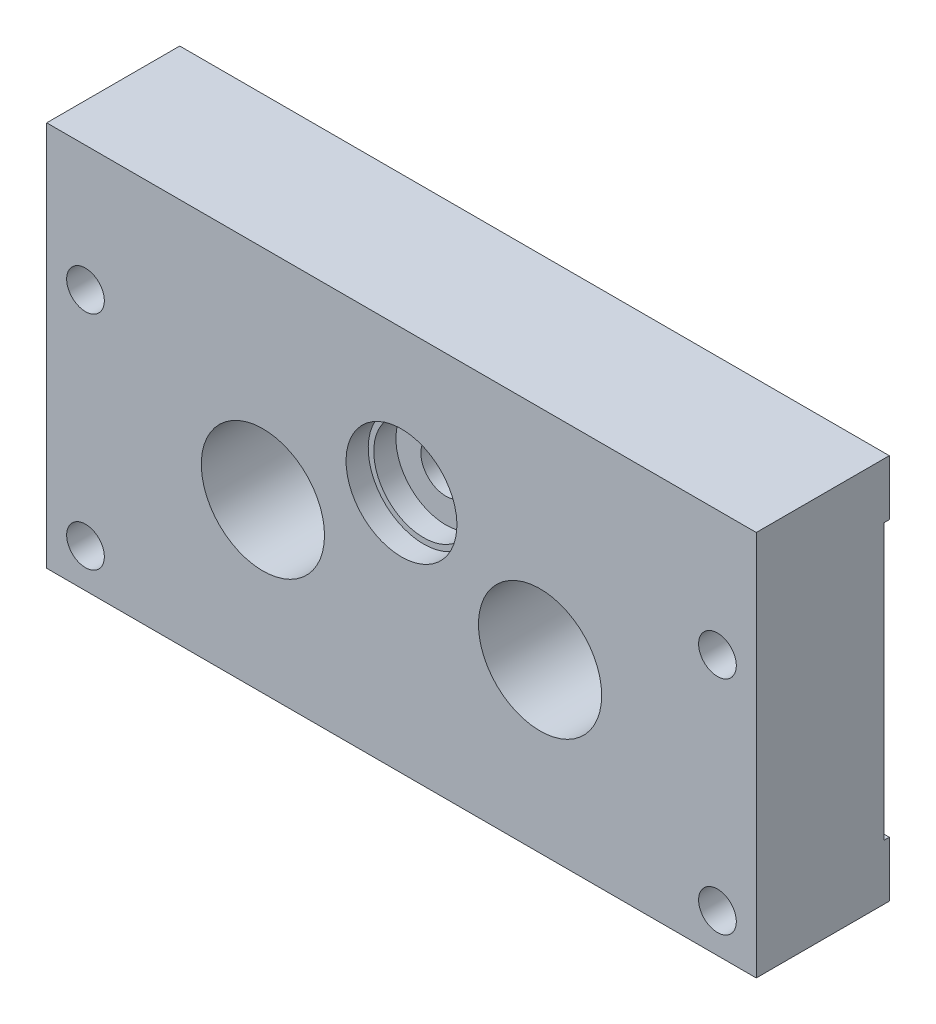
ISO-10303-21;
HEADER;
FILE_DESCRIPTION(('STEP AP214'),'2;1');
FILE_NAME('part.step','',(''),(''),'','','');
FILE_SCHEMA(('AUTOMOTIVE_DESIGN { 1 0 10303 214 1 1 1 1 }'));
ENDSEC;
DATA;
#1=APPLICATION_CONTEXT('core data for automotive mechanical design processes');
#2=APPLICATION_PROTOCOL_DEFINITION('international standard','automotive_design',2000,#1);
#3=PRODUCT_CONTEXT('',#1,'mechanical');
#4=PRODUCT('Part','Part','',(#3));
#5=PRODUCT_RELATED_PRODUCT_CATEGORY('part','',(#4));
#6=PRODUCT_DEFINITION_FORMATION('','',#4);
#7=PRODUCT_DEFINITION_CONTEXT('part definition',#1,'design');
#8=PRODUCT_DEFINITION('design','',#6,#7);
#9=PRODUCT_DEFINITION_SHAPE('','',#8);
#10=(LENGTH_UNIT() NAMED_UNIT(*) SI_UNIT(.MILLI.,.METRE.));
#11=(NAMED_UNIT(*) PLANE_ANGLE_UNIT() SI_UNIT($,.RADIAN.));
#12=(NAMED_UNIT(*) SI_UNIT($,.STERADIAN.) SOLID_ANGLE_UNIT());
#13=UNCERTAINTY_MEASURE_WITH_UNIT(LENGTH_MEASURE(1.E-05),#10,'distance_accuracy_value','');
#14=(GEOMETRIC_REPRESENTATION_CONTEXT(3) GLOBAL_UNCERTAINTY_ASSIGNED_CONTEXT((#13)) GLOBAL_UNIT_ASSIGNED_CONTEXT((#10,
#11,#12)) REPRESENTATION_CONTEXT('',''));
#15=CARTESIAN_POINT('',(0.,0.,0.));
#16=DIRECTION('',(0.,0.,1.));
#17=DIRECTION('',(1.,0.,0.));
#18=AXIS2_PLACEMENT_3D('',#15,#16,#17);
#19=CARTESIAN_POINT('',(32.,21.89,8.));
#20=DIRECTION('',(0.,0.,1.));
#21=DIRECTION('',(1.,0.,0.));
#22=AXIS2_PLACEMENT_3D('',#19,#20,#21);
#23=CYLINDRICAL_SURFACE('',#22,4.5);
#24=CARTESIAN_POINT('',(32.,21.89,8.));
#25=DIRECTION('',(0.,0.,1.));
#26=DIRECTION('',(1.,0.,0.));
#27=AXIS2_PLACEMENT_3D('',#24,#25,#26);
#28=CIRCLE('',#27,4.5);
#29=CARTESIAN_POINT('',(36.5,21.89,8.));
#30=VERTEX_POINT('',#29);
#31=EDGE_CURVE('E21',#30,#30,#28,.T.);
#32=ORIENTED_EDGE('',*,*,#31,.F.);
#33=EDGE_LOOP('',(#32));
#34=FACE_BOUND('',#33,.T.);
#35=CARTESIAN_POINT('',(32.,21.89,10.));
#36=DIRECTION('',(0.,0.,1.));
#37=DIRECTION('',(1.,0.,0.));
#38=AXIS2_PLACEMENT_3D('',#35,#36,#37);
#39=CIRCLE('',#38,4.5);
#40=CARTESIAN_POINT('',(36.5,21.89,10.));
#41=VERTEX_POINT('',#40);
#42=EDGE_CURVE('E339',#41,#41,#39,.F.);
#43=ORIENTED_EDGE('',*,*,#42,.F.);
#44=EDGE_LOOP('',(#43));
#45=FACE_BOUND('',#44,.T.);
#46=ADVANCED_FACE('F17',(#34,#45),#23,.F.);
#47=CARTESIAN_POINT('',(27.446,17.336,8.));
#48=DIRECTION('',(0.,0.,1.));
#49=DIRECTION('',(1.,0.,0.));
#50=AXIS2_PLACEMENT_3D('',#47,#48,#49);
#51=PLANE('',#50);
#52=CARTESIAN_POINT('',(32.,21.89,8.));
#53=DIRECTION('',(0.,0.,1.));
#54=DIRECTION('',(1.,0.,0.));
#55=AXIS2_PLACEMENT_3D('',#52,#53,#54);
#56=CIRCLE('',#55,2.25);
#57=CARTESIAN_POINT('',(34.25,21.89,8.));
#58=VERTEX_POINT('',#57);
#59=EDGE_CURVE('E337',#58,#58,#56,.T.);
#60=ORIENTED_EDGE('',*,*,#59,.F.);
#61=EDGE_LOOP('',(#60));
#62=FACE_BOUND('',#61,.T.);
#63=ORIENTED_EDGE('',*,*,#31,.T.);
#64=EDGE_LOOP('',(#63));
#65=FACE_BOUND('',#64,.T.);
#66=ADVANCED_FACE('F346',(#62,#65),#51,.T.);
#67=CARTESIAN_POINT('',(26.94,16.83,10.));
#68=DIRECTION('',(0.,0.,1.));
#69=DIRECTION('',(1.,0.,0.));
#70=AXIS2_PLACEMENT_3D('',#67,#68,#69);
#71=PLANE('',#70);
#72=ORIENTED_EDGE('',*,*,#42,.T.);
#73=EDGE_LOOP('',(#72));
#74=FACE_BOUND('',#73,.T.);
#75=CARTESIAN_POINT('',(32.,21.89,10.));
#76=DIRECTION('',(0.,0.,1.));
#77=DIRECTION('',(0.,-1.,0.));
#78=AXIS2_PLACEMENT_3D('',#75,#76,#77);
#79=CIRCLE('',#78,5.);
#80=CARTESIAN_POINT('',(32.,16.89,10.));
#81=VERTEX_POINT('',#80);
#82=EDGE_CURVE('E334',#81,#81,#79,.F.);
#83=ORIENTED_EDGE('',*,*,#82,.F.);
#84=EDGE_LOOP('',(#83));
#85=FACE_BOUND('',#84,.T.);
#86=ADVANCED_FACE('F355',(#74,#85),#71,.T.);
#87=CARTESIAN_POINT('',(32.,21.89,6.2));
#88=DIRECTION('',(0.,0.,1.));
#89=DIRECTION('',(1.,0.,0.));
#90=AXIS2_PLACEMENT_3D('',#87,#88,#89);
#91=CYLINDRICAL_SURFACE('',#90,2.25);
#92=ORIENTED_EDGE('',*,*,#59,.T.);
#93=EDGE_LOOP('',(#92));
#94=FACE_BOUND('',#93,.T.);
#95=CARTESIAN_POINT('',(32.,21.89,6.2));
#96=DIRECTION('',(0.,0.,1.));
#97=DIRECTION('',(1.,0.,0.));
#98=AXIS2_PLACEMENT_3D('',#95,#96,#97);
#99=CIRCLE('',#98,2.25);
#100=CARTESIAN_POINT('',(34.25,21.89,6.2));
#101=VERTEX_POINT('',#100);
#102=EDGE_CURVE('E331',#101,#101,#99,.T.);
#103=ORIENTED_EDGE('',*,*,#102,.F.);
#104=EDGE_LOOP('',(#103));
#105=FACE_BOUND('',#104,.T.);
#106=ADVANCED_FACE('F427',(#94,#105),#91,.F.);
#107=CARTESIAN_POINT('',(32.,21.89,10.));
#108=DIRECTION('',(0.,0.,1.));
#109=DIRECTION('',(0.,-1.,0.));
#110=AXIS2_PLACEMENT_3D('',#107,#108,#109);
#111=CYLINDRICAL_SURFACE('',#110,5.);
#112=ORIENTED_EDGE('',*,*,#82,.T.);
#113=EDGE_LOOP('',(#112));
#114=FACE_BOUND('',#113,.T.);
#115=CARTESIAN_POINT('',(32.,21.89,12.));
#116=DIRECTION('',(0.,0.,1.));
#117=DIRECTION('',(0.,-1.,0.));
#118=AXIS2_PLACEMENT_3D('',#115,#116,#117);
#119=CIRCLE('',#118,5.);
#120=CARTESIAN_POINT('',(32.,16.89,12.));
#121=VERTEX_POINT('',#120);
#122=EDGE_CURVE('E217',#121,#121,#119,.T.);
#123=ORIENTED_EDGE('',*,*,#122,.T.);
#124=EDGE_LOOP('',(#123));
#125=FACE_BOUND('',#124,.T.);
#126=ADVANCED_FACE('F424',(#114,#125),#111,.F.);
#127=CARTESIAN_POINT('',(3.5,3.5,12.));
#128=DIRECTION('',(0.,0.,-1.));
#129=DIRECTION('',(-1.,0.,0.));
#130=AXIS2_PLACEMENT_3D('',#127,#128,#129);
#131=CYLINDRICAL_SURFACE('',#130,1.7);
#132=CARTESIAN_POINT('',(3.5,3.5,12.));
#133=DIRECTION('',(0.,0.,-1.));
#134=DIRECTION('',(-1.,0.,0.));
#135=AXIS2_PLACEMENT_3D('',#132,#133,#134);
#136=CIRCLE('',#135,1.7);
#137=CARTESIAN_POINT('',(1.8,3.5,12.));
#138=VERTEX_POINT('',#137);
#139=EDGE_CURVE('E312',#138,#138,#136,.F.);
#140=ORIENTED_EDGE('',*,*,#139,.T.);
#141=EDGE_LOOP('',(#140));
#142=FACE_BOUND('',#141,.T.);
#143=CARTESIAN_POINT('',(3.5,3.5,9.));
#144=DIRECTION('',(0.,0.,-1.));
#145=DIRECTION('',(-1.,0.,0.));
#146=AXIS2_PLACEMENT_3D('',#143,#144,#145);
#147=CIRCLE('',#146,1.7);
#148=CARTESIAN_POINT('',(1.8,3.5,9.));
#149=VERTEX_POINT('',#148);
#150=EDGE_CURVE('E114',#149,#149,#147,.T.);
#151=ORIENTED_EDGE('',*,*,#150,.T.);
#152=EDGE_LOOP('',(#151));
#153=FACE_BOUND('',#152,.T.);
#154=ADVANCED_FACE('F420',(#142,#153),#131,.F.);
#155=CARTESIAN_POINT('',(60.5,3.5,12.));
#156=DIRECTION('',(0.,0.,-1.));
#157=DIRECTION('',(-1.,0.,0.));
#158=AXIS2_PLACEMENT_3D('',#155,#156,#157);
#159=CYLINDRICAL_SURFACE('',#158,1.7);
#160=CARTESIAN_POINT('',(60.5,3.5,12.));
#161=DIRECTION('',(0.,0.,-1.));
#162=DIRECTION('',(-1.,0.,0.));
#163=AXIS2_PLACEMENT_3D('',#160,#161,#162);
#164=CIRCLE('',#163,1.7);
#165=CARTESIAN_POINT('',(58.8,3.5,12.));
#166=VERTEX_POINT('',#165);
#167=EDGE_CURVE('E208',#166,#166,#164,.F.);
#168=ORIENTED_EDGE('',*,*,#167,.T.);
#169=EDGE_LOOP('',(#168));
#170=FACE_BOUND('',#169,.T.);
#171=CARTESIAN_POINT('',(60.5,3.5,9.));
#172=DIRECTION('',(0.,0.,-1.));
#173=DIRECTION('',(-1.,0.,0.));
#174=AXIS2_PLACEMENT_3D('',#171,#172,#173);
#175=CIRCLE('',#174,1.7);
#176=CARTESIAN_POINT('',(58.8,3.5,9.));
#177=VERTEX_POINT('',#176);
#178=EDGE_CURVE('E328',#177,#177,#175,.T.);
#179=ORIENTED_EDGE('',*,*,#178,.T.);
#180=EDGE_LOOP('',(#179));
#181=FACE_BOUND('',#180,.T.);
#182=ADVANCED_FACE('F416',(#170,#181),#159,.F.);
#183=CARTESIAN_POINT('',(19.5,15.1,3.9999906));
#184=DIRECTION('',(0.,0.,1.));
#185=DIRECTION('',(1.,0.,0.));
#186=AXIS2_PLACEMENT_3D('',#183,#184,#185);
#187=CYLINDRICAL_SURFACE('',#186,5.55625);
#188=CARTESIAN_POINT('',(19.5,15.1,3.9999906));
#189=DIRECTION('',(0.,0.,1.));
#190=DIRECTION('',(1.,0.,0.));
#191=AXIS2_PLACEMENT_3D('',#188,#189,#190);
#192=CIRCLE('',#191,5.55625);
#193=CARTESIAN_POINT('',(25.05625,15.1,3.9999906));
#194=VERTEX_POINT('',#193);
#195=EDGE_CURVE('E198',#194,#194,#192,.F.);
#196=ORIENTED_EDGE('',*,*,#195,.T.);
#197=EDGE_LOOP('',(#196));
#198=FACE_BOUND('',#197,.T.);
#199=CARTESIAN_POINT('',(19.5,15.1,12.));
#200=DIRECTION('',(0.,0.,1.));
#201=DIRECTION('',(1.,0.,0.));
#202=AXIS2_PLACEMENT_3D('',#199,#200,#201);
#203=CIRCLE('',#202,5.55625);
#204=CARTESIAN_POINT('',(25.05625,15.1,12.));
#205=VERTEX_POINT('',#204);
#206=EDGE_CURVE('E318',#205,#205,#203,.T.);
#207=ORIENTED_EDGE('',*,*,#206,.T.);
#208=EDGE_LOOP('',(#207));
#209=FACE_BOUND('',#208,.T.);
#210=ADVANCED_FACE('F412',(#198,#209),#187,.F.);
#211=CARTESIAN_POINT('',(44.5,15.1,3.9999906));
#212=DIRECTION('',(0.,0.,1.));
#213=DIRECTION('',(1.,0.,0.));
#214=AXIS2_PLACEMENT_3D('',#211,#212,#213);
#215=CYLINDRICAL_SURFACE('',#214,5.55625);
#216=CARTESIAN_POINT('',(44.5,15.1,3.9999906));
#217=DIRECTION('',(0.,0.,1.));
#218=DIRECTION('',(1.,0.,0.));
#219=AXIS2_PLACEMENT_3D('',#216,#217,#218);
#220=CIRCLE('',#219,5.55625);
#221=CARTESIAN_POINT('',(50.05625,15.1,3.9999906));
#222=VERTEX_POINT('',#221);
#223=EDGE_CURVE('E302',#222,#222,#220,.F.);
#224=ORIENTED_EDGE('',*,*,#223,.T.);
#225=EDGE_LOOP('',(#224));
#226=FACE_BOUND('',#225,.T.);
#227=CARTESIAN_POINT('',(44.5,15.1,12.));
#228=DIRECTION('',(0.,0.,1.));
#229=DIRECTION('',(1.,0.,0.));
#230=AXIS2_PLACEMENT_3D('',#227,#228,#229);
#231=CIRCLE('',#230,5.55625);
#232=CARTESIAN_POINT('',(50.05625,15.1,12.));
#233=VERTEX_POINT('',#232);
#234=EDGE_CURVE('E321',#233,#233,#231,.T.);
#235=ORIENTED_EDGE('',*,*,#234,.T.);
#236=EDGE_LOOP('',(#235));
#237=FACE_BOUND('',#236,.T.);
#238=ADVANCED_FACE('F408',(#226,#237),#215,.F.);
#239=CARTESIAN_POINT('',(3.5,23.5,12.));
#240=DIRECTION('',(0.,0.,-1.));
#241=DIRECTION('',(-1.,0.,0.));
#242=AXIS2_PLACEMENT_3D('',#239,#240,#241);
#243=CYLINDRICAL_SURFACE('',#242,1.7);
#244=CARTESIAN_POINT('',(3.5,23.5,12.));
#245=DIRECTION('',(0.,0.,-1.));
#246=DIRECTION('',(-1.,0.,0.));
#247=AXIS2_PLACEMENT_3D('',#244,#245,#246);
#248=CIRCLE('',#247,1.7);
#249=CARTESIAN_POINT('',(1.8,23.5,12.));
#250=VERTEX_POINT('',#249);
#251=EDGE_CURVE('E315',#250,#250,#248,.F.);
#252=ORIENTED_EDGE('',*,*,#251,.T.);
#253=EDGE_LOOP('',(#252));
#254=FACE_BOUND('',#253,.T.);
#255=CARTESIAN_POINT('',(3.5,23.5,9.));
#256=DIRECTION('',(0.,0.,-1.));
#257=DIRECTION('',(-1.,0.,0.));
#258=AXIS2_PLACEMENT_3D('',#255,#256,#257);
#259=CIRCLE('',#258,1.7);
#260=CARTESIAN_POINT('',(1.8,23.5,9.));
#261=VERTEX_POINT('',#260);
#262=EDGE_CURVE('E299',#261,#261,#259,.T.);
#263=ORIENTED_EDGE('',*,*,#262,.T.);
#264=EDGE_LOOP('',(#263));
#265=FACE_BOUND('',#264,.T.);
#266=ADVANCED_FACE('F404',(#254,#265),#243,.F.);
#267=CARTESIAN_POINT('',(60.5,23.5,12.));
#268=DIRECTION('',(0.,0.,-1.));
#269=DIRECTION('',(-1.,0.,0.));
#270=AXIS2_PLACEMENT_3D('',#267,#268,#269);
#271=CYLINDRICAL_SURFACE('',#270,1.7);
#272=CARTESIAN_POINT('',(60.5,23.5,12.));
#273=DIRECTION('',(0.,0.,-1.));
#274=DIRECTION('',(-1.,0.,0.));
#275=AXIS2_PLACEMENT_3D('',#272,#273,#274);
#276=CIRCLE('',#275,1.7);
#277=CARTESIAN_POINT('',(58.8,23.5,12.));
#278=VERTEX_POINT('',#277);
#279=EDGE_CURVE('E309',#278,#278,#276,.F.);
#280=ORIENTED_EDGE('',*,*,#279,.T.);
#281=EDGE_LOOP('',(#280));
#282=FACE_BOUND('',#281,.T.);
#283=CARTESIAN_POINT('',(60.5,23.5,9.));
#284=DIRECTION('',(0.,0.,-1.));
#285=DIRECTION('',(-1.,0.,0.));
#286=AXIS2_PLACEMENT_3D('',#283,#284,#285);
#287=CIRCLE('',#286,1.7);
#288=CARTESIAN_POINT('',(58.8,23.5,9.));
#289=VERTEX_POINT('',#288);
#290=EDGE_CURVE('E296',#289,#289,#287,.T.);
#291=ORIENTED_EDGE('',*,*,#290,.T.);
#292=EDGE_LOOP('',(#291));
#293=FACE_BOUND('',#292,.T.);
#294=ADVANCED_FACE('F400',(#282,#293),#271,.F.);
#295=CARTESIAN_POINT('',(27.446,17.336,6.2));
#296=DIRECTION('',(0.,0.,-1.));
#297=DIRECTION('',(0.,1.,0.));
#298=AXIS2_PLACEMENT_3D('',#295,#296,#297);
#299=PLANE('',#298);
#300=ORIENTED_EDGE('',*,*,#102,.T.);
#301=EDGE_LOOP('',(#300));
#302=FACE_BOUND('',#301,.T.);
#303=CARTESIAN_POINT('',(32.,21.89,6.2));
#304=DIRECTION('',(0.,0.,-1.));
#305=DIRECTION('',(-1.,0.,0.));
#306=AXIS2_PLACEMENT_3D('',#303,#304,#305);
#307=CIRCLE('',#306,4.5);
#308=CARTESIAN_POINT('',(27.5,21.89,6.2));
#309=VERTEX_POINT('',#308);
#310=EDGE_CURVE('E293',#309,#309,#307,.F.);
#311=ORIENTED_EDGE('',*,*,#310,.F.);
#312=EDGE_LOOP('',(#311));
#313=FACE_BOUND('',#312,.T.);
#314=ADVANCED_FACE('F403',(#302,#313),#299,.T.);
#315=CARTESIAN_POINT('',(57.6158,0.6158,9.));
#316=DIRECTION('',(0.,0.,1.));
#317=DIRECTION('',(1.,0.,0.));
#318=AXIS2_PLACEMENT_3D('',#315,#316,#317);
#319=PLANE('',#318);
#320=ORIENTED_EDGE('',*,*,#178,.F.);
#321=EDGE_LOOP('',(#320));
#322=FACE_BOUND('',#321,.T.);
#323=CARTESIAN_POINT('',(60.5,3.5,9.));
#324=DIRECTION('',(0.,0.,-1.));
#325=DIRECTION('',(-1.,0.,0.));
#326=AXIS2_PLACEMENT_3D('',#323,#324,#325);
#327=CIRCLE('',#326,2.85);
#328=CARTESIAN_POINT('',(57.65,3.5,9.));
#329=VERTEX_POINT('',#328);
#330=EDGE_CURVE('E126',#329,#329,#327,.F.);
#331=ORIENTED_EDGE('',*,*,#330,.F.);
#332=EDGE_LOOP('',(#331));
#333=FACE_BOUND('',#332,.T.);
#334=ADVANCED_FACE('F441',(#322,#333),#319,.F.);
#335=CARTESIAN_POINT('',(0.6158,0.6158,9.));
#336=DIRECTION('',(0.,0.,1.));
#337=DIRECTION('',(1.,0.,0.));
#338=AXIS2_PLACEMENT_3D('',#335,#336,#337);
#339=PLANE('',#338);
#340=ORIENTED_EDGE('',*,*,#150,.F.);
#341=EDGE_LOOP('',(#340));
#342=FACE_BOUND('',#341,.T.);
#343=CARTESIAN_POINT('',(3.5,3.5,9.));
#344=DIRECTION('',(0.,0.,-1.));
#345=DIRECTION('',(-1.,0.,0.));
#346=AXIS2_PLACEMENT_3D('',#343,#344,#345);
#347=CIRCLE('',#346,2.85);
#348=CARTESIAN_POINT('',(0.65,3.5,9.));
#349=VERTEX_POINT('',#348);
#350=EDGE_CURVE('E180',#349,#349,#347,.F.);
#351=ORIENTED_EDGE('',*,*,#350,.F.);
#352=EDGE_LOOP('',(#351));
#353=FACE_BOUND('',#352,.T.);
#354=ADVANCED_FACE('F506',(#342,#353),#339,.F.);
#355=CARTESIAN_POINT('',(64.,0.,0.));
#356=DIRECTION('',(0.,0.,-1.));
#357=DIRECTION('',(-1.,0.,0.));
#358=AXIS2_PLACEMENT_3D('',#355,#356,#357);
#359=PLANE('',#358);
#360=DIRECTION('',(1.,0.,0.));
#361=VECTOR('',#360,1.);
#362=CARTESIAN_POINT('',(32.,5.,0.));
#363=LINE('',#362,#361);
#364=CARTESIAN_POINT('',(5.92332416310743,5.00000000016656,0.));
#365=VERTEX_POINT('',#364);
#366=CARTESIAN_POINT('',(58.0766758368947,5.,0.));
#367=VERTEX_POINT('',#366);
#368=EDGE_CURVE('E121',#365,#367,#363,.T.);
#369=ORIENTED_EDGE('',*,*,#368,.T.);
#370=CARTESIAN_POINT('',(60.5,3.5,0.));
#371=DIRECTION('',(0.,0.,-1.));
#372=DIRECTION('',(-1.,0.,0.));
#373=AXIS2_PLACEMENT_3D('',#370,#371,#372);
#374=CIRCLE('',#373,2.85);
#375=CARTESIAN_POINT('',(62.9233241631053,5.,0.));
#376=VERTEX_POINT('',#375);
#377=EDGE_CURVE('E118',#376,#367,#374,.T.);
#378=ORIENTED_EDGE('',*,*,#377,.F.);
#379=DIRECTION('',(1.,0.,0.));
#380=VECTOR('',#379,1.);
#381=CARTESIAN_POINT('',(32.,5.,0.));
#382=LINE('',#381,#380);
#383=CARTESIAN_POINT('',(64.,5.,0.));
#384=VERTEX_POINT('',#383);
#385=EDGE_CURVE('E103',#376,#384,#382,.T.);
#386=ORIENTED_EDGE('',*,*,#385,.T.);
#387=DIRECTION('',(0.,-1.,0.));
#388=VECTOR('',#387,1.);
#389=CARTESIAN_POINT('',(64.,17.4,0.));
#390=LINE('',#389,#388);
#391=CARTESIAN_POINT('',(64.,0.,0.));
#392=VERTEX_POINT('',#391);
#393=EDGE_CURVE('E182',#384,#392,#390,.T.);
#394=ORIENTED_EDGE('',*,*,#393,.T.);
#395=DIRECTION('',(-1.,0.,0.));
#396=VECTOR('',#395,1.);
#397=CARTESIAN_POINT('',(32.,0.,0.));
#398=LINE('',#397,#396);
#399=CARTESIAN_POINT('',(0.,0.,0.));
#400=VERTEX_POINT('',#399);
#401=EDGE_CURVE('E113',#392,#400,#398,.T.);
#402=ORIENTED_EDGE('',*,*,#401,.T.);
#403=DIRECTION('',(0.,1.,0.));
#404=VECTOR('',#403,1.);
#405=CARTESIAN_POINT('',(0.,17.4,0.));
#406=LINE('',#405,#404);
#407=CARTESIAN_POINT('',(0.,5.00000000186667,0.));
#408=VERTEX_POINT('',#407);
#409=EDGE_CURVE('E169',#400,#408,#406,.T.);
#410=ORIENTED_EDGE('',*,*,#409,.T.);
#411=DIRECTION('',(1.,0.,0.));
#412=VECTOR('',#411,1.);
#413=CARTESIAN_POINT('',(0.5383379185,5.,0.));
#414=LINE('',#413,#412);
#415=CARTESIAN_POINT('',(1.07667583689474,5.,0.));
#416=VERTEX_POINT('',#415);
#417=EDGE_CURVE('E175',#408,#416,#414,.T.);
#418=ORIENTED_EDGE('',*,*,#417,.T.);
#419=CARTESIAN_POINT('',(3.5,3.5,0.));
#420=DIRECTION('',(0.,0.,-1.));
#421=DIRECTION('',(-1.,0.,0.));
#422=AXIS2_PLACEMENT_3D('',#419,#420,#421);
#423=CIRCLE('',#422,2.85);
#424=EDGE_CURVE('E176',#365,#416,#423,.T.);
#425=ORIENTED_EDGE('',*,*,#424,.F.);
#426=EDGE_LOOP('',(#369,#378,#386,#394,#402,#410,#418,#425));
#427=FACE_BOUND('',#426,.T.);
#428=ADVANCED_FACE('F119',(#427),#359,.T.);
#429=CARTESIAN_POINT('',(0.,0.,0.));
#430=DIRECTION('',(0.,1.,0.));
#431=DIRECTION('',(0.,0.,1.));
#432=AXIS2_PLACEMENT_3D('',#429,#430,#431);
#433=PLANE('',#432);
#434=DIRECTION('',(0.,0.,1.));
#435=VECTOR('',#434,1.);
#436=CARTESIAN_POINT('',(64.,0.,6.));
#437=LINE('',#436,#435);
#438=CARTESIAN_POINT('',(64.,0.,12.));
#439=VERTEX_POINT('',#438);
#440=EDGE_CURVE('E184',#392,#439,#437,.T.);
#441=ORIENTED_EDGE('',*,*,#440,.T.);
#442=DIRECTION('',(-1.,0.,0.));
#443=VECTOR('',#442,1.);
#444=CARTESIAN_POINT('',(32.,0.,12.));
#445=LINE('',#444,#443);
#446=CARTESIAN_POINT('',(0.,0.,12.));
#447=VERTEX_POINT('',#446);
#448=EDGE_CURVE('E215',#439,#447,#445,.T.);
#449=ORIENTED_EDGE('',*,*,#448,.T.);
#450=DIRECTION('',(0.,0.,-1.));
#451=VECTOR('',#450,1.);
#452=CARTESIAN_POINT('',(0.,0.,6.));
#453=LINE('',#452,#451);
#454=EDGE_CURVE('E245',#447,#400,#453,.T.);
#455=ORIENTED_EDGE('',*,*,#454,.T.);
#456=ORIENTED_EDGE('',*,*,#401,.F.);
#457=EDGE_LOOP('',(#441,#449,#455,#456));
#458=FACE_BOUND('',#457,.T.);
#459=ADVANCED_FACE('F499',(#458),#433,.F.);
#460=CARTESIAN_POINT('',(64.,0.,12.));
#461=DIRECTION('',(0.,0.,-1.));
#462=DIRECTION('',(-1.,0.,0.));
#463=AXIS2_PLACEMENT_3D('',#460,#461,#462);
#464=PLANE('',#463);
#465=ORIENTED_EDGE('',*,*,#167,.F.);
#466=EDGE_LOOP('',(#465));
#467=FACE_BOUND('',#466,.T.);
#468=ORIENTED_EDGE('',*,*,#279,.F.);
#469=EDGE_LOOP('',(#468));
#470=FACE_BOUND('',#469,.T.);
#471=ORIENTED_EDGE('',*,*,#139,.F.);
#472=EDGE_LOOP('',(#471));
#473=FACE_BOUND('',#472,.T.);
#474=ORIENTED_EDGE('',*,*,#251,.F.);
#475=EDGE_LOOP('',(#474));
#476=FACE_BOUND('',#475,.T.);
#477=ORIENTED_EDGE('',*,*,#206,.F.);
#478=EDGE_LOOP('',(#477));
#479=FACE_BOUND('',#478,.T.);
#480=ORIENTED_EDGE('',*,*,#234,.F.);
#481=EDGE_LOOP('',(#480));
#482=FACE_BOUND('',#481,.T.);
#483=ORIENTED_EDGE('',*,*,#122,.F.);
#484=EDGE_LOOP('',(#483));
#485=FACE_BOUND('',#484,.T.);
#486=ORIENTED_EDGE('',*,*,#448,.F.);
#487=DIRECTION('',(0.,1.,0.));
#488=VECTOR('',#487,1.);
#489=CARTESIAN_POINT('',(64.,17.4,12.));
#490=LINE('',#489,#488);
#491=CARTESIAN_POINT('',(64.,34.8,12.));
#492=VERTEX_POINT('',#491);
#493=EDGE_CURVE('E204',#439,#492,#490,.T.);
#494=ORIENTED_EDGE('',*,*,#493,.T.);
#495=DIRECTION('',(-1.,0.,0.));
#496=VECTOR('',#495,1.);
#497=CARTESIAN_POINT('',(32.,34.8,12.));
#498=LINE('',#497,#496);
#499=CARTESIAN_POINT('',(0.,34.8,12.));
#500=VERTEX_POINT('',#499);
#501=EDGE_CURVE('E199',#492,#500,#498,.T.);
#502=ORIENTED_EDGE('',*,*,#501,.T.);
#503=DIRECTION('',(0.,-1.,0.));
#504=VECTOR('',#503,1.);
#505=CARTESIAN_POINT('',(0.,17.4,12.));
#506=LINE('',#505,#504);
#507=EDGE_CURVE('E236',#500,#447,#506,.T.);
#508=ORIENTED_EDGE('',*,*,#507,.T.);
#509=EDGE_LOOP('',(#486,#494,#502,#508));
#510=FACE_BOUND('',#509,.T.);
#511=ADVANCED_FACE('F495',(#467,#470,#473,#476,#479,#482,#485,#510),#464,.F.);
#512=CARTESIAN_POINT('',(0.,34.8,12.));
#513=DIRECTION('',(0.,-1.,0.));
#514=DIRECTION('',(0.,0.,-1.));
#515=AXIS2_PLACEMENT_3D('',#512,#513,#514);
#516=PLANE('',#515);
#517=DIRECTION('',(0.,0.,1.));
#518=VECTOR('',#517,1.);
#519=CARTESIAN_POINT('',(0.,34.8,6.));
#520=LINE('',#519,#518);
#521=CARTESIAN_POINT('',(0.,34.8,0.));
#522=VERTEX_POINT('',#521);
#523=EDGE_CURVE('E233',#522,#500,#520,.T.);
#524=ORIENTED_EDGE('',*,*,#523,.T.);
#525=ORIENTED_EDGE('',*,*,#501,.F.);
#526=DIRECTION('',(0.,0.,-1.));
#527=VECTOR('',#526,1.);
#528=CARTESIAN_POINT('',(64.,34.8,6.));
#529=LINE('',#528,#527);
#530=CARTESIAN_POINT('',(64.,34.8,0.));
#531=VERTEX_POINT('',#530);
#532=EDGE_CURVE('E193',#492,#531,#529,.T.);
#533=ORIENTED_EDGE('',*,*,#532,.T.);
#534=DIRECTION('',(1.,0.,0.));
#535=VECTOR('',#534,1.);
#536=CARTESIAN_POINT('',(32.,34.8,0.));
#537=LINE('',#536,#535);
#538=EDGE_CURVE('E196',#522,#531,#537,.T.);
#539=ORIENTED_EDGE('',*,*,#538,.F.);
#540=EDGE_LOOP('',(#524,#525,#533,#539));
#541=FACE_BOUND('',#540,.T.);
#542=ADVANCED_FACE('F491',(#541),#516,.F.);
#543=CARTESIAN_POINT('',(64.,29.8,0.));
#544=DIRECTION('',(0.,0.,-1.));
#545=DIRECTION('',(-1.,0.,0.));
#546=AXIS2_PLACEMENT_3D('',#543,#544,#545);
#547=PLANE('',#546);
#548=ORIENTED_EDGE('',*,*,#538,.T.);
#549=DIRECTION('',(0.,-1.,0.));
#550=VECTOR('',#549,1.);
#551=CARTESIAN_POINT('',(64.,17.4,0.));
#552=LINE('',#551,#550);
#553=CARTESIAN_POINT('',(64.,29.7999999981333,0.));
#554=VERTEX_POINT('',#553);
#555=EDGE_CURVE('E136',#531,#554,#552,.T.);
#556=ORIENTED_EDGE('',*,*,#555,.T.);
#557=DIRECTION('',(-1.,0.,0.));
#558=VECTOR('',#557,1.);
#559=CARTESIAN_POINT('',(32.,29.8,0.));
#560=LINE('',#559,#558);
#561=CARTESIAN_POINT('',(0.,29.7999999990667,0.));
#562=VERTEX_POINT('',#561);
#563=EDGE_CURVE('E158',#554,#562,#560,.T.);
#564=ORIENTED_EDGE('',*,*,#563,.T.);
#565=DIRECTION('',(0.,1.,0.));
#566=VECTOR('',#565,1.);
#567=CARTESIAN_POINT('',(0.,17.4,0.));
#568=LINE('',#567,#566);
#569=EDGE_CURVE('E159',#562,#522,#568,.T.);
#570=ORIENTED_EDGE('',*,*,#569,.T.);
#571=EDGE_LOOP('',(#548,#556,#564,#570));
#572=FACE_BOUND('',#571,.T.);
#573=ADVANCED_FACE('F487',(#572),#547,.T.);
#574=CARTESIAN_POINT('',(25.122925,9.477075,3.9999906));
#575=DIRECTION('',(0.,0.,-1.));
#576=DIRECTION('',(-1.,0.,0.));
#577=AXIS2_PLACEMENT_3D('',#574,#575,#576);
#578=PLANE('',#577);
#579=CARTESIAN_POINT('',(19.5,15.1,3.9999906));
#580=DIRECTION('',(0.,0.,1.));
#581=DIRECTION('',(1.,0.,0.));
#582=AXIS2_PLACEMENT_3D('',#579,#580,#581);
#583=CIRCLE('',#582,3.3782);
#584=CARTESIAN_POINT('',(22.8782,15.1,3.9999906));
#585=VERTEX_POINT('',#584);
#586=EDGE_CURVE('E133',#585,#585,#583,.T.);
#587=ORIENTED_EDGE('',*,*,#586,.F.);
#588=EDGE_LOOP('',(#587));
#589=FACE_BOUND('',#588,.T.);
#590=ORIENTED_EDGE('',*,*,#195,.F.);
#591=EDGE_LOOP('',(#590));
#592=FACE_BOUND('',#591,.T.);
#593=ADVANCED_FACE('F483',(#589,#592),#578,.F.);
#594=CARTESIAN_POINT('',(50.122925,9.477075,3.9999906));
#595=DIRECTION('',(0.,0.,-1.));
#596=DIRECTION('',(-1.,0.,0.));
#597=AXIS2_PLACEMENT_3D('',#594,#595,#596);
#598=PLANE('',#597);
#599=CARTESIAN_POINT('',(44.5,15.1,3.9999906));
#600=DIRECTION('',(0.,0.,1.));
#601=DIRECTION('',(1.,0.,0.));
#602=AXIS2_PLACEMENT_3D('',#599,#600,#601);
#603=CIRCLE('',#602,3.3782);
#604=CARTESIAN_POINT('',(47.8782,15.1,3.9999906));
#605=VERTEX_POINT('',#604);
#606=EDGE_CURVE('E283',#605,#605,#603,.T.);
#607=ORIENTED_EDGE('',*,*,#606,.F.);
#608=EDGE_LOOP('',(#607));
#609=FACE_BOUND('',#608,.T.);
#610=ORIENTED_EDGE('',*,*,#223,.F.);
#611=EDGE_LOOP('',(#610));
#612=FACE_BOUND('',#611,.T.);
#613=ADVANCED_FACE('F479',(#609,#612),#598,.F.);
#614=CARTESIAN_POINT('',(0.6158,20.6158,9.));
#615=DIRECTION('',(0.,0.,1.));
#616=DIRECTION('',(1.,0.,0.));
#617=AXIS2_PLACEMENT_3D('',#614,#615,#616);
#618=PLANE('',#617);
#619=ORIENTED_EDGE('',*,*,#262,.F.);
#620=EDGE_LOOP('',(#619));
#621=FACE_BOUND('',#620,.T.);
#622=CARTESIAN_POINT('',(3.5,23.5,9.));
#623=DIRECTION('',(0.,0.,-1.));
#624=DIRECTION('',(-1.,0.,0.));
#625=AXIS2_PLACEMENT_3D('',#622,#623,#624);
#626=CIRCLE('',#625,2.85);
#627=CARTESIAN_POINT('',(0.65,23.5,9.));
#628=VERTEX_POINT('',#627);
#629=EDGE_CURVE('E280',#628,#628,#626,.F.);
#630=ORIENTED_EDGE('',*,*,#629,.F.);
#631=EDGE_LOOP('',(#630));
#632=FACE_BOUND('',#631,.T.);
#633=ADVANCED_FACE('F475',(#621,#632),#618,.F.);
#634=CARTESIAN_POINT('',(57.6158,20.6158,9.));
#635=DIRECTION('',(0.,0.,1.));
#636=DIRECTION('',(1.,0.,0.));
#637=AXIS2_PLACEMENT_3D('',#634,#635,#636);
#638=PLANE('',#637);
#639=ORIENTED_EDGE('',*,*,#290,.F.);
#640=EDGE_LOOP('',(#639));
#641=FACE_BOUND('',#640,.T.);
#642=CARTESIAN_POINT('',(60.5,23.5,9.));
#643=DIRECTION('',(0.,0.,-1.));
#644=DIRECTION('',(-1.,0.,0.));
#645=AXIS2_PLACEMENT_3D('',#642,#643,#644);
#646=CIRCLE('',#645,2.85);
#647=CARTESIAN_POINT('',(57.65,23.5,9.));
#648=VERTEX_POINT('',#647);
#649=EDGE_CURVE('E277',#648,#648,#646,.F.);
#650=ORIENTED_EDGE('',*,*,#649,.F.);
#651=EDGE_LOOP('',(#650));
#652=FACE_BOUND('',#651,.T.);
#653=ADVANCED_FACE('F398',(#641,#652),#638,.F.);
#654=CARTESIAN_POINT('',(32.,21.89,6.2));
#655=DIRECTION('',(0.,0.,-1.));
#656=DIRECTION('',(-1.,0.,0.));
#657=AXIS2_PLACEMENT_3D('',#654,#655,#656);
#658=CYLINDRICAL_SURFACE('',#657,4.5);
#659=ORIENTED_EDGE('',*,*,#310,.T.);
#660=EDGE_LOOP('',(#659));
#661=FACE_BOUND('',#660,.T.);
#662=CARTESIAN_POINT('',(32.,21.89,4.2));
#663=DIRECTION('',(0.,0.,-1.));
#664=DIRECTION('',(-1.,0.,0.));
#665=AXIS2_PLACEMENT_3D('',#662,#663,#664);
#666=CIRCLE('',#665,4.5);
#667=CARTESIAN_POINT('',(27.5,21.89,4.2));
#668=VERTEX_POINT('',#667);
#669=EDGE_CURVE('E274',#668,#668,#666,.F.);
#670=ORIENTED_EDGE('',*,*,#669,.F.);
#671=EDGE_LOOP('',(#670));
#672=FACE_BOUND('',#671,.T.);
#673=ADVANCED_FACE('F394',(#661,#672),#658,.F.);
#674=CARTESIAN_POINT('',(60.5,3.5,9.));
#675=DIRECTION('',(0.,0.,-1.));
#676=DIRECTION('',(-1.,0.,0.));
#677=AXIS2_PLACEMENT_3D('',#674,#675,#676);
#678=CYLINDRICAL_SURFACE('',#677,2.85);
#679=ORIENTED_EDGE('',*,*,#330,.T.);
#680=EDGE_LOOP('',(#679));
#681=FACE_BOUND('',#680,.T.);
#682=DIRECTION('',(0.,0.,-1.));
#683=VECTOR('',#682,1.);
#684=CARTESIAN_POINT('',(62.923324163,5.,0.25));
#685=LINE('',#684,#683);
#686=CARTESIAN_POINT('',(62.9233241631053,5.,0.500000001999999));
#687=VERTEX_POINT('',#686);
#688=EDGE_CURVE('E108',#687,#376,#685,.T.);
#689=ORIENTED_EDGE('',*,*,#688,.T.);
#690=ORIENTED_EDGE('',*,*,#377,.T.);
#691=DIRECTION('',(0.,0.,1.));
#692=VECTOR('',#691,1.);
#693=CARTESIAN_POINT('',(58.076675837,5.,0.25));
#694=LINE('',#693,#692);
#695=CARTESIAN_POINT('',(58.0766758368947,5.,0.500000001999999));
#696=VERTEX_POINT('',#695);
#697=EDGE_CURVE('E125',#367,#696,#694,.T.);
#698=ORIENTED_EDGE('',*,*,#697,.T.);
#699=CARTESIAN_POINT('',(60.5,3.5,0.500000003999999));
#700=DIRECTION('',(0.,0.,-1.));
#701=DIRECTION('',(-1.,0.,0.));
#702=AXIS2_PLACEMENT_3D('',#699,#700,#701);
#703=CIRCLE('',#702,2.85);
#704=EDGE_CURVE('E130',#687,#696,#703,.F.);
#705=ORIENTED_EDGE('',*,*,#704,.F.);
#706=EDGE_LOOP('',(#689,#690,#698,#705));
#707=FACE_BOUND('',#706,.T.);
#708=ADVANCED_FACE('F129',(#681,#707),#678,.F.);
#709=CARTESIAN_POINT('',(5.923324163,5.,0.5));
#710=DIRECTION('',(0.,-1.,0.));
#711=DIRECTION('',(0.,0.,-1.));
#712=AXIS2_PLACEMENT_3D('',#709,#710,#711);
#713=PLANE('',#712);
#714=DIRECTION('',(0.,0.,1.));
#715=VECTOR('',#714,1.);
#716=CARTESIAN_POINT('',(5.92332416300433,5.00000000033312,4.5));
#717=LINE('',#716,#715);
#718=CARTESIAN_POINT('',(5.92332416310743,5.00000000008328,0.500000001999999));
#719=VERTEX_POINT('',#718);
#720=EDGE_CURVE('E177',#719,#365,#717,.F.);
#721=ORIENTED_EDGE('',*,*,#720,.F.);
#722=DIRECTION('',(-1.,0.,0.));
#723=VECTOR('',#722,1.);
#724=CARTESIAN_POINT('',(32.,5.,0.5));
#725=LINE('',#724,#723);
#726=EDGE_CURVE('E139',#696,#719,#725,.T.);
#727=ORIENTED_EDGE('',*,*,#726,.F.);
#728=ORIENTED_EDGE('',*,*,#697,.F.);
#729=ORIENTED_EDGE('',*,*,#368,.F.);
#730=EDGE_LOOP('',(#721,#727,#728,#729));
#731=FACE_BOUND('',#730,.T.);
#732=ADVANCED_FACE('F390',(#731),#713,.F.);
#733=CARTESIAN_POINT('',(3.5,3.5,9.));
#734=DIRECTION('',(0.,0.,-1.));
#735=DIRECTION('',(-1.,0.,0.));
#736=AXIS2_PLACEMENT_3D('',#733,#734,#735);
#737=CYLINDRICAL_SURFACE('',#736,2.85);
#738=ORIENTED_EDGE('',*,*,#350,.T.);
#739=EDGE_LOOP('',(#738));
#740=FACE_BOUND('',#739,.T.);
#741=ORIENTED_EDGE('',*,*,#720,.T.);
#742=ORIENTED_EDGE('',*,*,#424,.T.);
#743=DIRECTION('',(0.,0.,1.));
#744=VECTOR('',#743,1.);
#745=CARTESIAN_POINT('',(1.076675837,5.,0.25));
#746=LINE('',#745,#744);
#747=CARTESIAN_POINT('',(1.07667583689474,5.,0.500000001999999));
#748=VERTEX_POINT('',#747);
#749=EDGE_CURVE('E172',#416,#748,#746,.T.);
#750=ORIENTED_EDGE('',*,*,#749,.T.);
#751=CARTESIAN_POINT('',(3.5,3.5,0.500000003999999));
#752=DIRECTION('',(0.,0.,-1.));
#753=DIRECTION('',(-1.,0.,0.));
#754=AXIS2_PLACEMENT_3D('',#751,#752,#753);
#755=CIRCLE('',#754,2.85);
#756=EDGE_CURVE('E271',#719,#748,#755,.F.);
#757=ORIENTED_EDGE('',*,*,#756,.F.);
#758=EDGE_LOOP('',(#741,#742,#750,#757));
#759=FACE_BOUND('',#758,.T.);
#760=ADVANCED_FACE('F386',(#740,#759),#737,.F.);
#761=CARTESIAN_POINT('',(0.,5.,0.5));
#762=DIRECTION('',(0.,-1.,0.));
#763=DIRECTION('',(0.,0.,-1.));
#764=AXIS2_PLACEMENT_3D('',#761,#762,#763);
#765=PLANE('',#764);
#766=DIRECTION('',(0.,0.,1.));
#767=VECTOR('',#766,1.);
#768=CARTESIAN_POINT('',(0.,5.0000000028,6.));
#769=LINE('',#768,#767);
#770=CARTESIAN_POINT('',(0.,5.00000000093334,0.5));
#771=VERTEX_POINT('',#770);
#772=EDGE_CURVE('E166',#408,#771,#769,.T.);
#773=ORIENTED_EDGE('',*,*,#772,.T.);
#774=DIRECTION('',(-1.,0.,0.));
#775=VECTOR('',#774,1.);
#776=CARTESIAN_POINT('',(32.,5.,0.5));
#777=LINE('',#776,#775);
#778=EDGE_CURVE('E163',#748,#771,#777,.T.);
#779=ORIENTED_EDGE('',*,*,#778,.F.);
#780=ORIENTED_EDGE('',*,*,#749,.F.);
#781=ORIENTED_EDGE('',*,*,#417,.F.);
#782=EDGE_LOOP('',(#773,#779,#780,#781));
#783=FACE_BOUND('',#782,.T.);
#784=ADVANCED_FACE('F389',(#783),#765,.F.);
#785=CARTESIAN_POINT('',(0.,0.,12.));
#786=DIRECTION('',(1.,0.,0.));
#787=DIRECTION('',(0.,0.,-1.));
#788=AXIS2_PLACEMENT_3D('',#785,#786,#787);
#789=PLANE('',#788);
#790=DIRECTION('',(0.,0.,1.));
#791=VECTOR('',#790,1.);
#792=CARTESIAN_POINT('',(0.,29.8,0.25));
#793=LINE('',#792,#791);
#794=CARTESIAN_POINT('',(0.,29.8,0.5));
#795=VERTEX_POINT('',#794);
#796=EDGE_CURVE('E155',#562,#795,#793,.T.);
#797=ORIENTED_EDGE('',*,*,#796,.T.);
#798=DIRECTION('',(0.,1.,0.));
#799=VECTOR('',#798,1.);
#800=CARTESIAN_POINT('',(0.,17.4,0.5));
#801=LINE('',#800,#799);
#802=EDGE_CURVE('E152',#771,#795,#801,.T.);
#803=ORIENTED_EDGE('',*,*,#802,.F.);
#804=ORIENTED_EDGE('',*,*,#772,.F.);
#805=ORIENTED_EDGE('',*,*,#409,.F.);
#806=ORIENTED_EDGE('',*,*,#454,.F.);
#807=ORIENTED_EDGE('',*,*,#507,.F.);
#808=ORIENTED_EDGE('',*,*,#523,.F.);
#809=ORIENTED_EDGE('',*,*,#569,.F.);
#810=EDGE_LOOP('',(#797,#803,#804,#805,#806,#807,#808,#809));
#811=FACE_BOUND('',#810,.T.);
#812=ADVANCED_FACE('F462',(#811),#789,.F.);
#813=CARTESIAN_POINT('',(0.,29.8,0.));
#814=DIRECTION('',(0.,1.,0.));
#815=DIRECTION('',(0.,0.,1.));
#816=AXIS2_PLACEMENT_3D('',#813,#814,#815);
#817=PLANE('',#816);
#818=DIRECTION('',(0.,0.,1.));
#819=VECTOR('',#818,1.);
#820=CARTESIAN_POINT('',(64.,29.7999999972,6.));
#821=LINE('',#820,#819);
#822=CARTESIAN_POINT('',(64.,29.7999999990667,0.5));
#823=VERTEX_POINT('',#822);
#824=EDGE_CURVE('E131',#554,#823,#821,.T.);
#825=ORIENTED_EDGE('',*,*,#824,.T.);
#826=DIRECTION('',(1.,0.,0.));
#827=VECTOR('',#826,1.);
#828=CARTESIAN_POINT('',(32.,29.8,0.5));
#829=LINE('',#828,#827);
#830=EDGE_CURVE('E146',#795,#823,#829,.T.);
#831=ORIENTED_EDGE('',*,*,#830,.F.);
#832=ORIENTED_EDGE('',*,*,#796,.F.);
#833=ORIENTED_EDGE('',*,*,#563,.F.);
#834=EDGE_LOOP('',(#825,#831,#832,#833));
#835=FACE_BOUND('',#834,.T.);
#836=ADVANCED_FACE('F458',(#835),#817,.F.);
#837=CARTESIAN_POINT('',(64.,0.,0.));
#838=DIRECTION('',(-1.,0.,0.));
#839=DIRECTION('',(0.,0.,1.));
#840=AXIS2_PLACEMENT_3D('',#837,#838,#839);
#841=PLANE('',#840);
#842=ORIENTED_EDGE('',*,*,#824,.F.);
#843=ORIENTED_EDGE('',*,*,#555,.F.);
#844=ORIENTED_EDGE('',*,*,#532,.F.);
#845=ORIENTED_EDGE('',*,*,#493,.F.);
#846=ORIENTED_EDGE('',*,*,#440,.F.);
#847=ORIENTED_EDGE('',*,*,#393,.F.);
#848=DIRECTION('',(0.,0.,1.));
#849=VECTOR('',#848,1.);
#850=CARTESIAN_POINT('',(64.,5.,0.25));
#851=LINE('',#850,#849);
#852=CARTESIAN_POINT('',(64.,5.,0.5));
#853=VERTEX_POINT('',#852);
#854=EDGE_CURVE('E109',#384,#853,#851,.T.);
#855=ORIENTED_EDGE('',*,*,#854,.T.);
#856=DIRECTION('',(0.,-1.,0.));
#857=VECTOR('',#856,1.);
#858=CARTESIAN_POINT('',(64.,17.4,0.5));
#859=LINE('',#858,#857);
#860=EDGE_CURVE('E36',#823,#853,#859,.T.);
#861=ORIENTED_EDGE('',*,*,#860,.F.);
#862=EDGE_LOOP('',(#842,#843,#844,#845,#846,#847,#855,#861));
#863=FACE_BOUND('',#862,.T.);
#864=ADVANCED_FACE('F455',(#863),#841,.F.);
#865=CARTESIAN_POINT('',(62.923324163,5.,0.5));
#866=DIRECTION('',(0.,-1.,0.));
#867=DIRECTION('',(0.,0.,-1.));
#868=AXIS2_PLACEMENT_3D('',#865,#866,#867);
#869=PLANE('',#868);
#870=ORIENTED_EDGE('',*,*,#854,.F.);
#871=ORIENTED_EDGE('',*,*,#385,.F.);
#872=ORIENTED_EDGE('',*,*,#688,.F.);
#873=DIRECTION('',(-1.,0.,0.));
#874=VECTOR('',#873,1.);
#875=CARTESIAN_POINT('',(32.,5.,0.5));
#876=LINE('',#875,#874);
#877=EDGE_CURVE('E145',#853,#687,#876,.T.);
#878=ORIENTED_EDGE('',*,*,#877,.F.);
#879=EDGE_LOOP('',(#870,#871,#872,#878));
#880=FACE_BOUND('',#879,.T.);
#881=ADVANCED_FACE('F105',(#880),#869,.F.);
#882=CARTESIAN_POINT('',(19.5,15.1,0.5));
#883=DIRECTION('',(0.,0.,1.));
#884=DIRECTION('',(1.,0.,0.));
#885=AXIS2_PLACEMENT_3D('',#882,#883,#884);
#886=CYLINDRICAL_SURFACE('',#885,3.3782);
#887=ORIENTED_EDGE('',*,*,#586,.T.);
#888=EDGE_LOOP('',(#887));
#889=FACE_BOUND('',#888,.T.);
#890=CARTESIAN_POINT('',(19.5,15.1,0.5));
#891=DIRECTION('',(0.,0.,1.));
#892=DIRECTION('',(1.,0.,0.));
#893=AXIS2_PLACEMENT_3D('',#890,#891,#892);
#894=CIRCLE('',#893,3.3782);
#895=CARTESIAN_POINT('',(22.8782,15.1,0.5));
#896=VERTEX_POINT('',#895);
#897=EDGE_CURVE('E268',#896,#896,#894,.T.);
#898=ORIENTED_EDGE('',*,*,#897,.F.);
#899=EDGE_LOOP('',(#898));
#900=FACE_BOUND('',#899,.T.);
#901=ADVANCED_FACE('F381',(#889,#900),#886,.F.);
#902=CARTESIAN_POINT('',(44.5,15.1,0.5));
#903=DIRECTION('',(0.,0.,1.));
#904=DIRECTION('',(1.,0.,0.));
#905=AXIS2_PLACEMENT_3D('',#902,#903,#904);
#906=CYLINDRICAL_SURFACE('',#905,3.3782);
#907=ORIENTED_EDGE('',*,*,#606,.T.);
#908=EDGE_LOOP('',(#907));
#909=FACE_BOUND('',#908,.T.);
#910=CARTESIAN_POINT('',(44.5,15.1,0.5));
#911=DIRECTION('',(0.,0.,1.));
#912=DIRECTION('',(1.,0.,0.));
#913=AXIS2_PLACEMENT_3D('',#910,#911,#912);
#914=CIRCLE('',#913,3.3782);
#915=CARTESIAN_POINT('',(47.8782,15.1,0.5));
#916=VERTEX_POINT('',#915);
#917=EDGE_CURVE('E265',#916,#916,#914,.T.);
#918=ORIENTED_EDGE('',*,*,#917,.F.);
#919=EDGE_LOOP('',(#918));
#920=FACE_BOUND('',#919,.T.);
#921=ADVANCED_FACE('F377',(#909,#920),#906,.F.);
#922=CARTESIAN_POINT('',(3.5,23.5,9.));
#923=DIRECTION('',(0.,0.,-1.));
#924=DIRECTION('',(-1.,0.,0.));
#925=AXIS2_PLACEMENT_3D('',#922,#923,#924);
#926=CYLINDRICAL_SURFACE('',#925,2.85);
#927=ORIENTED_EDGE('',*,*,#629,.T.);
#928=EDGE_LOOP('',(#927));
#929=FACE_BOUND('',#928,.T.);
#930=CARTESIAN_POINT('',(3.5,23.5,0.5));
#931=DIRECTION('',(0.,0.,-1.));
#932=DIRECTION('',(-1.,0.,0.));
#933=AXIS2_PLACEMENT_3D('',#930,#931,#932);
#934=CIRCLE('',#933,2.85);
#935=CARTESIAN_POINT('',(0.65,23.5,0.5));
#936=VERTEX_POINT('',#935);
#937=EDGE_CURVE('E262',#936,#936,#934,.F.);
#938=ORIENTED_EDGE('',*,*,#937,.F.);
#939=EDGE_LOOP('',(#938));
#940=FACE_BOUND('',#939,.T.);
#941=ADVANCED_FACE('F373',(#929,#940),#926,.F.);
#942=CARTESIAN_POINT('',(60.5,23.5,9.));
#943=DIRECTION('',(0.,0.,-1.));
#944=DIRECTION('',(-1.,0.,0.));
#945=AXIS2_PLACEMENT_3D('',#942,#943,#944);
#946=CYLINDRICAL_SURFACE('',#945,2.85);
#947=ORIENTED_EDGE('',*,*,#649,.T.);
#948=EDGE_LOOP('',(#947));
#949=FACE_BOUND('',#948,.T.);
#950=CARTESIAN_POINT('',(60.5,23.5,0.5));
#951=DIRECTION('',(0.,0.,-1.));
#952=DIRECTION('',(-1.,0.,0.));
#953=AXIS2_PLACEMENT_3D('',#950,#951,#952);
#954=CIRCLE('',#953,2.85);
#955=CARTESIAN_POINT('',(57.65,23.5,0.5));
#956=VERTEX_POINT('',#955);
#957=EDGE_CURVE('E259',#956,#956,#954,.F.);
#958=ORIENTED_EDGE('',*,*,#957,.F.);
#959=EDGE_LOOP('',(#958));
#960=FACE_BOUND('',#959,.T.);
#961=ADVANCED_FACE('F370',(#949,#960),#946,.F.);
#962=CARTESIAN_POINT('',(26.94,16.83,4.2));
#963=DIRECTION('',(0.,0.,-1.));
#964=DIRECTION('',(0.,1.,0.));
#965=AXIS2_PLACEMENT_3D('',#962,#963,#964);
#966=PLANE('',#965);
#967=ORIENTED_EDGE('',*,*,#669,.T.);
#968=EDGE_LOOP('',(#967));
#969=FACE_BOUND('',#968,.T.);
#970=CARTESIAN_POINT('',(32.,21.89,4.2));
#971=DIRECTION('',(0.,0.,-1.));
#972=DIRECTION('',(-1.,0.,0.));
#973=AXIS2_PLACEMENT_3D('',#970,#971,#972);
#974=CIRCLE('',#973,5.);
#975=CARTESIAN_POINT('',(27.,21.89,4.2));
#976=VERTEX_POINT('',#975);
#977=EDGE_CURVE('E27',#976,#976,#974,.F.);
#978=ORIENTED_EDGE('',*,*,#977,.F.);
#979=EDGE_LOOP('',(#978));
#980=FACE_BOUND('',#979,.T.);
#981=ADVANCED_FACE('F366',(#969,#980),#966,.T.);
#982=CARTESIAN_POINT('',(0.,5.,0.5));
#983=DIRECTION('',(0.,0.,-1.));
#984=DIRECTION('',(0.,1.,0.));
#985=AXIS2_PLACEMENT_3D('',#982,#983,#984);
#986=PLANE('',#985);
#987=ORIENTED_EDGE('',*,*,#957,.T.);
#988=EDGE_LOOP('',(#987));
#989=FACE_BOUND('',#988,.T.);
#990=ORIENTED_EDGE('',*,*,#937,.T.);
#991=EDGE_LOOP('',(#990));
#992=FACE_BOUND('',#991,.T.);
#993=ORIENTED_EDGE('',*,*,#917,.T.);
#994=EDGE_LOOP('',(#993));
#995=FACE_BOUND('',#994,.T.);
#996=ORIENTED_EDGE('',*,*,#897,.T.);
#997=EDGE_LOOP('',(#996));
#998=FACE_BOUND('',#997,.T.);
#999=CARTESIAN_POINT('',(32.,21.89,0.5));
#1000=DIRECTION('',(0.,0.,-1.));
#1001=DIRECTION('',(-1.,0.,0.));
#1002=AXIS2_PLACEMENT_3D('',#999,#1000,#1001);
#1003=CIRCLE('',#1002,5.);
#1004=CARTESIAN_POINT('',(27.,21.89,0.5));
#1005=VERTEX_POINT('',#1004);
#1006=EDGE_CURVE('E11',#1005,#1005,#1003,.T.);
#1007=ORIENTED_EDGE('',*,*,#1006,.F.);
#1008=EDGE_LOOP('',(#1007));
#1009=FACE_BOUND('',#1008,.T.);
#1010=ORIENTED_EDGE('',*,*,#860,.T.);
#1011=ORIENTED_EDGE('',*,*,#877,.T.);
#1012=ORIENTED_EDGE('',*,*,#704,.T.);
#1013=ORIENTED_EDGE('',*,*,#726,.T.);
#1014=ORIENTED_EDGE('',*,*,#756,.T.);
#1015=ORIENTED_EDGE('',*,*,#778,.T.);
#1016=ORIENTED_EDGE('',*,*,#802,.T.);
#1017=ORIENTED_EDGE('',*,*,#830,.T.);
#1018=EDGE_LOOP('',(#1010,#1011,#1012,#1013,#1014,#1015,#1016,#1017));
#1019=FACE_BOUND('',#1018,.T.);
#1020=ADVANCED_FACE('F19',(#989,#992,#995,#998,#1009,#1019),#986,.T.);
#1021=CARTESIAN_POINT('',(32.,21.89,4.2));
#1022=DIRECTION('',(0.,0.,-1.));
#1023=DIRECTION('',(-1.,0.,0.));
#1024=AXIS2_PLACEMENT_3D('',#1021,#1022,#1023);
#1025=CYLINDRICAL_SURFACE('',#1024,5.);
#1026=ORIENTED_EDGE('',*,*,#1006,.T.);
#1027=EDGE_LOOP('',(#1026));
#1028=FACE_BOUND('',#1027,.T.);
#1029=ORIENTED_EDGE('',*,*,#977,.T.);
#1030=EDGE_LOOP('',(#1029));
#1031=FACE_BOUND('',#1030,.T.);
#1032=ADVANCED_FACE('F359',(#1028,#1031),#1025,.F.);
#1033=CLOSED_SHELL('',(#46,#66,#86,#106,#126,#154,#182,#210,#238,#266,#294,#314,#334,#354,#428,
#459,#511,#542,#573,#593,#613,#633,#653,#673,#708,#732,#760,#784,#812,#836,#864,#881,#901,#921,
#941,#961,#981,#1020,#1032));
#1034=MANIFOLD_SOLID_BREP('B1',#1033);
#1035=ADVANCED_BREP_SHAPE_REPRESENTATION('',(#18,#1034),#14);
#1036=SHAPE_DEFINITION_REPRESENTATION(#9,#1035);
ENDSEC;
END-ISO-10303-21;
